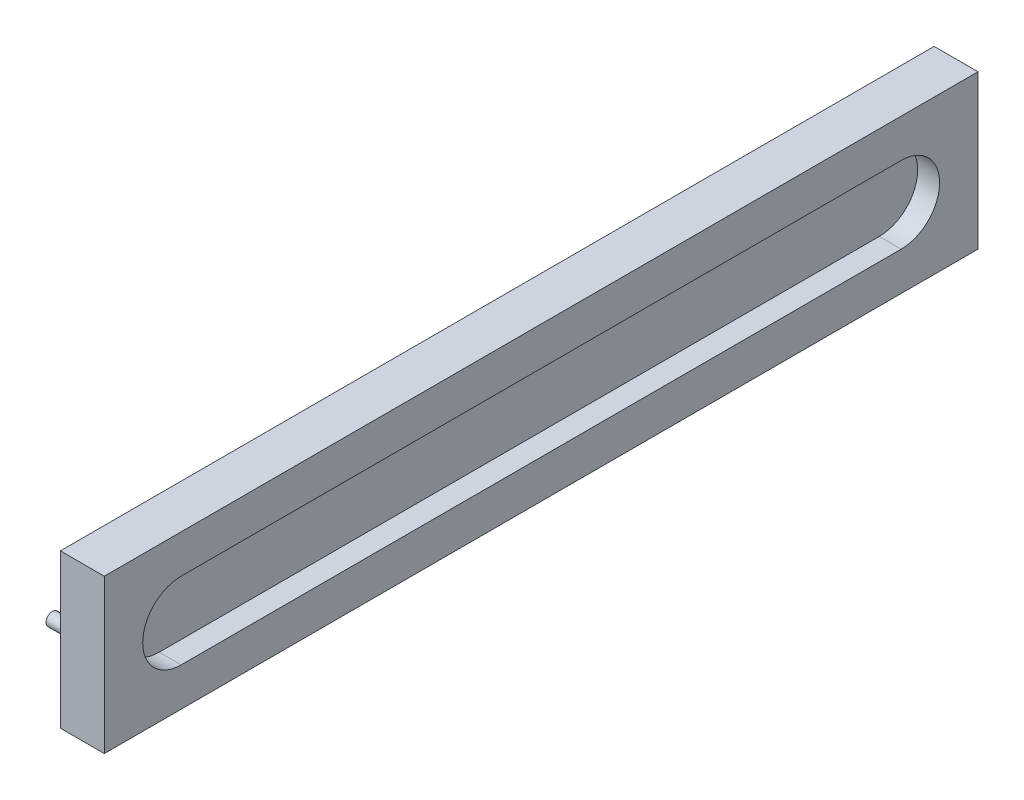
ISO-10303-21;
HEADER;
FILE_DESCRIPTION(('STEP AP214'),'2;1');
FILE_NAME('part.step','',(''),(''),'','','');
FILE_SCHEMA(('AUTOMOTIVE_DESIGN { 1 0 10303 214 1 1 1 1 }'));
ENDSEC;
DATA;
#1=APPLICATION_CONTEXT('core data for automotive mechanical design processes');
#2=APPLICATION_PROTOCOL_DEFINITION('international standard','automotive_design',2000,#1);
#3=PRODUCT_CONTEXT('',#1,'mechanical');
#4=PRODUCT('Part','Part','',(#3));
#5=PRODUCT_RELATED_PRODUCT_CATEGORY('part','',(#4));
#6=PRODUCT_DEFINITION_FORMATION('','',#4);
#7=PRODUCT_DEFINITION_CONTEXT('part definition',#1,'design');
#8=PRODUCT_DEFINITION('design','',#6,#7);
#9=PRODUCT_DEFINITION_SHAPE('','',#8);
#10=(LENGTH_UNIT() NAMED_UNIT(*) SI_UNIT(.MILLI.,.METRE.));
#11=(NAMED_UNIT(*) PLANE_ANGLE_UNIT() SI_UNIT($,.RADIAN.));
#12=(NAMED_UNIT(*) SI_UNIT($,.STERADIAN.) SOLID_ANGLE_UNIT());
#13=UNCERTAINTY_MEASURE_WITH_UNIT(LENGTH_MEASURE(1.E-05),#10,'distance_accuracy_value','');
#14=(GEOMETRIC_REPRESENTATION_CONTEXT(3) GLOBAL_UNCERTAINTY_ASSIGNED_CONTEXT((#13)) GLOBAL_UNIT_ASSIGNED_CONTEXT((#10,
#11,#12)) REPRESENTATION_CONTEXT('',''));
#15=CARTESIAN_POINT('',(0.,0.,0.));
#16=DIRECTION('',(0.,0.,1.));
#17=DIRECTION('',(1.,0.,0.));
#18=AXIS2_PLACEMENT_3D('',#15,#16,#17);
#19=CARTESIAN_POINT('',(20.,0.,0.));
#20=DIRECTION('',(0.,0.,-1.));
#21=DIRECTION('',(-1.,0.,0.));
#22=AXIS2_PLACEMENT_3D('',#19,#20,#21);
#23=PLANE('',#22);
#24=DIRECTION('',(0.,-1.,0.));
#25=VECTOR('',#24,1.);
#26=CARTESIAN_POINT('',(0.,0.,0.));
#27=LINE('',#26,#25);
#28=CARTESIAN_POINT('',(0.,70.,0.));
#29=VERTEX_POINT('',#28);
#30=CARTESIAN_POINT('',(0.,0.,0.));
#31=VERTEX_POINT('',#30);
#32=EDGE_CURVE('E149',#29,#31,#27,.T.);
#33=ORIENTED_EDGE('',*,*,#32,.T.);
#34=DIRECTION('',(-1.,0.,0.));
#35=VECTOR('',#34,1.);
#36=CARTESIAN_POINT('',(20.,0.,0.));
#37=LINE('',#36,#35);
#38=CARTESIAN_POINT('',(20.,0.,0.));
#39=VERTEX_POINT('',#38);
#40=EDGE_CURVE('E11',#39,#31,#37,.T.);
#41=ORIENTED_EDGE('',*,*,#40,.F.);
#42=DIRECTION('',(0.,-1.,0.));
#43=VECTOR('',#42,1.);
#44=CARTESIAN_POINT('',(20.,0.,0.));
#45=LINE('',#44,#43);
#46=CARTESIAN_POINT('',(20.,70.,0.));
#47=VERTEX_POINT('',#46);
#48=EDGE_CURVE('E153',#47,#39,#45,.T.);
#49=ORIENTED_EDGE('',*,*,#48,.F.);
#50=DIRECTION('',(-1.,0.,0.));
#51=VECTOR('',#50,1.);
#52=CARTESIAN_POINT('',(20.,70.,0.));
#53=LINE('',#52,#51);
#54=EDGE_CURVE('E159',#47,#29,#53,.T.);
#55=ORIENTED_EDGE('',*,*,#54,.T.);
#56=EDGE_LOOP('',(#33,#41,#49,#55));
#57=FACE_BOUND('',#56,.T.);
#58=ADVANCED_FACE('F37',(#57),#23,.F.);
#59=CARTESIAN_POINT('',(20.,0.,0.));
#60=DIRECTION('',(0.,1.,0.));
#61=DIRECTION('',(0.,0.,1.));
#62=AXIS2_PLACEMENT_3D('',#59,#60,#61);
#63=PLANE('',#62);
#64=DIRECTION('',(0.,0.,-1.));
#65=VECTOR('',#64,1.);
#66=CARTESIAN_POINT('',(0.,0.,0.));
#67=LINE('',#66,#65);
#68=CARTESIAN_POINT('',(0.,0.,-398.100558659218));
#69=VERTEX_POINT('',#68);
#70=EDGE_CURVE('E162',#31,#69,#67,.T.);
#71=ORIENTED_EDGE('',*,*,#70,.T.);
#72=DIRECTION('',(-1.,0.,0.));
#73=VECTOR('',#72,1.);
#74=CARTESIAN_POINT('',(20.,0.,-398.100558659218));
#75=LINE('',#74,#73);
#76=CARTESIAN_POINT('',(20.,0.,-398.100558659218));
#77=VERTEX_POINT('',#76);
#78=EDGE_CURVE('E44',#77,#69,#75,.T.);
#79=ORIENTED_EDGE('',*,*,#78,.F.);
#80=DIRECTION('',(0.,0.,-1.));
#81=VECTOR('',#80,1.);
#82=CARTESIAN_POINT('',(20.,0.,0.));
#83=LINE('',#82,#81);
#84=EDGE_CURVE('E88',#39,#77,#83,.T.);
#85=ORIENTED_EDGE('',*,*,#84,.F.);
#86=ORIENTED_EDGE('',*,*,#40,.T.);
#87=EDGE_LOOP('',(#71,#79,#85,#86));
#88=FACE_BOUND('',#87,.T.);
#89=ADVANCED_FACE('F191',(#88),#63,.F.);
#90=CARTESIAN_POINT('',(20.,0.,-398.100558659218));
#91=DIRECTION('',(0.,0.,1.));
#92=DIRECTION('',(1.,0.,0.));
#93=AXIS2_PLACEMENT_3D('',#90,#91,#92);
#94=PLANE('',#93);
#95=DIRECTION('',(0.,1.,0.));
#96=VECTOR('',#95,1.);
#97=CARTESIAN_POINT('',(0.,0.,-398.100558659218));
#98=LINE('',#97,#96);
#99=CARTESIAN_POINT('',(0.,70.,-398.100558659218));
#100=VERTEX_POINT('',#99);
#101=EDGE_CURVE('E164',#69,#100,#98,.T.);
#102=ORIENTED_EDGE('',*,*,#101,.T.);
#103=DIRECTION('',(-1.,0.,0.));
#104=VECTOR('',#103,1.);
#105=CARTESIAN_POINT('',(20.,70.,-398.100558659218));
#106=LINE('',#105,#104);
#107=CARTESIAN_POINT('',(20.,70.,-398.100558659218));
#108=VERTEX_POINT('',#107);
#109=EDGE_CURVE('E168',#108,#100,#106,.T.);
#110=ORIENTED_EDGE('',*,*,#109,.F.);
#111=DIRECTION('',(0.,1.,0.));
#112=VECTOR('',#111,1.);
#113=CARTESIAN_POINT('',(20.,0.,-398.100558659218));
#114=LINE('',#113,#112);
#115=EDGE_CURVE('E156',#77,#108,#114,.T.);
#116=ORIENTED_EDGE('',*,*,#115,.F.);
#117=ORIENTED_EDGE('',*,*,#78,.T.);
#118=EDGE_LOOP('',(#102,#110,#116,#117));
#119=FACE_BOUND('',#118,.T.);
#120=ADVANCED_FACE('F173',(#119),#94,.F.);
#121=CARTESIAN_POINT('',(20.,70.,0.));
#122=DIRECTION('',(0.,-1.,0.));
#123=DIRECTION('',(0.,0.,-1.));
#124=AXIS2_PLACEMENT_3D('',#121,#122,#123);
#125=PLANE('',#124);
#126=DIRECTION('',(0.,0.,1.));
#127=VECTOR('',#126,1.);
#128=CARTESIAN_POINT('',(0.,70.,0.));
#129=LINE('',#128,#127);
#130=EDGE_CURVE('E81',#100,#29,#129,.T.);
#131=ORIENTED_EDGE('',*,*,#130,.T.);
#132=ORIENTED_EDGE('',*,*,#54,.F.);
#133=DIRECTION('',(0.,0.,1.));
#134=VECTOR('',#133,1.);
#135=CARTESIAN_POINT('',(20.,70.,0.));
#136=LINE('',#135,#134);
#137=EDGE_CURVE('E60',#108,#47,#136,.T.);
#138=ORIENTED_EDGE('',*,*,#137,.F.);
#139=ORIENTED_EDGE('',*,*,#109,.T.);
#140=EDGE_LOOP('',(#131,#132,#138,#139));
#141=FACE_BOUND('',#140,.T.);
#142=ADVANCED_FACE('F181',(#141),#125,.F.);
#143=CARTESIAN_POINT('',(20.,0.,0.));
#144=DIRECTION('',(-1.,0.,0.));
#145=DIRECTION('',(0.,0.,1.));
#146=AXIS2_PLACEMENT_3D('',#143,#144,#145);
#147=PLANE('',#146);
#148=DIRECTION('',(0.,0.,-1.));
#149=VECTOR('',#148,1.);
#150=CARTESIAN_POINT('',(20.,17.5,-35.));
#151=LINE('',#150,#149);
#152=CARTESIAN_POINT('',(20.,17.5,-35.));
#153=VERTEX_POINT('',#152);
#154=CARTESIAN_POINT('',(20.,17.5,-363.100558659218));
#155=VERTEX_POINT('',#154);
#156=EDGE_CURVE('E142',#153,#155,#151,.T.);
#157=ORIENTED_EDGE('',*,*,#156,.F.);
#158=CARTESIAN_POINT('',(20.,35.,-35.));
#159=DIRECTION('',(1.,0.,0.));
#160=DIRECTION('',(0.,0.,-1.));
#161=AXIS2_PLACEMENT_3D('',#158,#159,#160);
#162=CIRCLE('',#161,17.5);
#163=CARTESIAN_POINT('',(20.,52.5,-35.));
#164=VERTEX_POINT('',#163);
#165=EDGE_CURVE('E51',#164,#153,#162,.T.);
#166=ORIENTED_EDGE('',*,*,#165,.F.);
#167=DIRECTION('',(0.,0.,1.));
#168=VECTOR('',#167,1.);
#169=CARTESIAN_POINT('',(20.,52.5,-35.));
#170=LINE('',#169,#168);
#171=CARTESIAN_POINT('',(20.,52.5,-363.100558659218));
#172=VERTEX_POINT('',#171);
#173=EDGE_CURVE('E130',#172,#164,#170,.T.);
#174=ORIENTED_EDGE('',*,*,#173,.F.);
#175=CARTESIAN_POINT('',(20.,35.,-363.100558659218));
#176=DIRECTION('',(1.,0.,0.));
#177=DIRECTION('',(0.,0.,1.));
#178=AXIS2_PLACEMENT_3D('',#175,#176,#177);
#179=CIRCLE('',#178,17.5);
#180=EDGE_CURVE('E133',#155,#172,#179,.T.);
#181=ORIENTED_EDGE('',*,*,#180,.F.);
#182=EDGE_LOOP('',(#157,#166,#174,#181));
#183=FACE_BOUND('',#182,.T.);
#184=ORIENTED_EDGE('',*,*,#48,.T.);
#185=ORIENTED_EDGE('',*,*,#84,.T.);
#186=ORIENTED_EDGE('',*,*,#115,.T.);
#187=ORIENTED_EDGE('',*,*,#137,.T.);
#188=EDGE_LOOP('',(#184,#185,#186,#187));
#189=FACE_BOUND('',#188,.T.);
#190=ADVANCED_FACE('F183',(#183,#189),#147,.F.);
#191=CARTESIAN_POINT('',(0.,0.,0.));
#192=DIRECTION('',(-1.,0.,0.));
#193=DIRECTION('',(0.,0.,1.));
#194=AXIS2_PLACEMENT_3D('',#191,#192,#193);
#195=PLANE('',#194);
#196=CARTESIAN_POINT('',(0.,35.,-6.35000000000002));
#197=DIRECTION('',(-1.,0.,0.));
#198=DIRECTION('',(0.,0.,-1.));
#199=AXIS2_PLACEMENT_3D('',#196,#197,#198);
#200=CIRCLE('',#199,2.921);
#201=CARTESIAN_POINT('',(0.,35.,-9.27100000000002));
#202=VERTEX_POINT('',#201);
#203=EDGE_CURVE('E311',#202,#202,#200,.T.);
#204=ORIENTED_EDGE('',*,*,#203,.F.);
#205=EDGE_LOOP('',(#204));
#206=FACE_BOUND('',#205,.T.);
#207=CARTESIAN_POINT('',(0.,35.,-391.750558659218));
#208=DIRECTION('',(-1.,0.,0.));
#209=DIRECTION('',(0.,0.,1.));
#210=AXIS2_PLACEMENT_3D('',#207,#208,#209);
#211=CIRCLE('',#210,2.921);
#212=CARTESIAN_POINT('',(0.,35.,-388.829558659218));
#213=VERTEX_POINT('',#212);
#214=EDGE_CURVE('E136',#213,#213,#211,.T.);
#215=ORIENTED_EDGE('',*,*,#214,.F.);
#216=EDGE_LOOP('',(#215));
#217=FACE_BOUND('',#216,.T.);
#218=ORIENTED_EDGE('',*,*,#32,.F.);
#219=ORIENTED_EDGE('',*,*,#130,.F.);
#220=ORIENTED_EDGE('',*,*,#101,.F.);
#221=ORIENTED_EDGE('',*,*,#70,.F.);
#222=EDGE_LOOP('',(#218,#219,#220,#221));
#223=FACE_BOUND('',#222,.T.);
#224=ADVANCED_FACE('F177',(#206,#217,#223),#195,.T.);
#225=CARTESIAN_POINT('',(10.,35.,-35.));
#226=DIRECTION('',(1.,0.,0.));
#227=DIRECTION('',(0.,0.,-1.));
#228=AXIS2_PLACEMENT_3D('',#225,#226,#227);
#229=CYLINDRICAL_SURFACE('',#228,17.5);
#230=ORIENTED_EDGE('',*,*,#165,.T.);
#231=DIRECTION('',(1.,0.,0.));
#232=VECTOR('',#231,1.);
#233=CARTESIAN_POINT('',(10.,17.5,-35.));
#234=LINE('',#233,#232);
#235=CARTESIAN_POINT('',(10.,17.5,-35.));
#236=VERTEX_POINT('',#235);
#237=EDGE_CURVE('E108',#236,#153,#234,.T.);
#238=ORIENTED_EDGE('',*,*,#237,.F.);
#239=CARTESIAN_POINT('',(10.,35.,-35.));
#240=DIRECTION('',(1.,0.,0.));
#241=DIRECTION('',(0.,0.,-1.));
#242=AXIS2_PLACEMENT_3D('',#239,#240,#241);
#243=CIRCLE('',#242,17.5);
#244=CARTESIAN_POINT('',(10.,52.5,-35.));
#245=VERTEX_POINT('',#244);
#246=EDGE_CURVE('E112',#245,#236,#243,.T.);
#247=ORIENTED_EDGE('',*,*,#246,.F.);
#248=DIRECTION('',(1.,0.,0.));
#249=VECTOR('',#248,1.);
#250=CARTESIAN_POINT('',(10.,52.5,-35.));
#251=LINE('',#250,#249);
#252=EDGE_CURVE('E147',#245,#164,#251,.T.);
#253=ORIENTED_EDGE('',*,*,#252,.T.);
#254=EDGE_LOOP('',(#230,#238,#247,#253));
#255=FACE_BOUND('',#254,.T.);
#256=ADVANCED_FACE('F110',(#255),#229,.F.);
#257=CARTESIAN_POINT('',(10.,52.5,-35.));
#258=DIRECTION('',(0.,1.,0.));
#259=DIRECTION('',(0.,0.,1.));
#260=AXIS2_PLACEMENT_3D('',#257,#258,#259);
#261=PLANE('',#260);
#262=ORIENTED_EDGE('',*,*,#173,.T.);
#263=ORIENTED_EDGE('',*,*,#252,.F.);
#264=DIRECTION('',(0.,0.,1.));
#265=VECTOR('',#264,1.);
#266=CARTESIAN_POINT('',(10.,52.5,-35.));
#267=LINE('',#266,#265);
#268=CARTESIAN_POINT('',(10.,52.5,-363.100558659218));
#269=VERTEX_POINT('',#268);
#270=EDGE_CURVE('E118',#269,#245,#267,.T.);
#271=ORIENTED_EDGE('',*,*,#270,.F.);
#272=DIRECTION('',(1.,0.,0.));
#273=VECTOR('',#272,1.);
#274=CARTESIAN_POINT('',(10.,52.5,-363.100558659218));
#275=LINE('',#274,#273);
#276=EDGE_CURVE('E150',#269,#172,#275,.T.);
#277=ORIENTED_EDGE('',*,*,#276,.T.);
#278=EDGE_LOOP('',(#262,#263,#271,#277));
#279=FACE_BOUND('',#278,.T.);
#280=ADVANCED_FACE('F225',(#279),#261,.F.);
#281=CARTESIAN_POINT('',(10.,35.,-363.100558659218));
#282=DIRECTION('',(1.,0.,0.));
#283=DIRECTION('',(0.,0.,-1.));
#284=AXIS2_PLACEMENT_3D('',#281,#282,#283);
#285=CYLINDRICAL_SURFACE('',#284,17.5);
#286=ORIENTED_EDGE('',*,*,#180,.T.);
#287=ORIENTED_EDGE('',*,*,#276,.F.);
#288=CARTESIAN_POINT('',(10.,35.,-363.100558659218));
#289=DIRECTION('',(1.,0.,0.));
#290=DIRECTION('',(0.,0.,1.));
#291=AXIS2_PLACEMENT_3D('',#288,#289,#290);
#292=CIRCLE('',#291,17.5);
#293=CARTESIAN_POINT('',(10.,17.5,-363.100558659218));
#294=VERTEX_POINT('',#293);
#295=EDGE_CURVE('E126',#294,#269,#292,.T.);
#296=ORIENTED_EDGE('',*,*,#295,.F.);
#297=DIRECTION('',(1.,0.,0.));
#298=VECTOR('',#297,1.);
#299=CARTESIAN_POINT('',(10.,17.5,-363.100558659218));
#300=LINE('',#299,#298);
#301=EDGE_CURVE('E117',#294,#155,#300,.T.);
#302=ORIENTED_EDGE('',*,*,#301,.T.);
#303=EDGE_LOOP('',(#286,#287,#296,#302));
#304=FACE_BOUND('',#303,.T.);
#305=ADVANCED_FACE('F234',(#304),#285,.F.);
#306=CARTESIAN_POINT('',(10.,17.5,-35.));
#307=DIRECTION('',(0.,-1.,0.));
#308=DIRECTION('',(0.,0.,-1.));
#309=AXIS2_PLACEMENT_3D('',#306,#307,#308);
#310=PLANE('',#309);
#311=ORIENTED_EDGE('',*,*,#156,.T.);
#312=ORIENTED_EDGE('',*,*,#301,.F.);
#313=DIRECTION('',(0.,0.,-1.));
#314=VECTOR('',#313,1.);
#315=CARTESIAN_POINT('',(10.,17.5,-35.));
#316=LINE('',#315,#314);
#317=EDGE_CURVE('E121',#236,#294,#316,.T.);
#318=ORIENTED_EDGE('',*,*,#317,.F.);
#319=ORIENTED_EDGE('',*,*,#237,.T.);
#320=EDGE_LOOP('',(#311,#312,#318,#319));
#321=FACE_BOUND('',#320,.T.);
#322=ADVANCED_FACE('F122',(#321),#310,.F.);
#323=CARTESIAN_POINT('',(10.,35.,-35.));
#324=DIRECTION('',(1.,0.,0.));
#325=DIRECTION('',(0.,0.,-1.));
#326=AXIS2_PLACEMENT_3D('',#323,#324,#325);
#327=PLANE('',#326);
#328=ORIENTED_EDGE('',*,*,#246,.T.);
#329=ORIENTED_EDGE('',*,*,#317,.T.);
#330=ORIENTED_EDGE('',*,*,#295,.T.);
#331=ORIENTED_EDGE('',*,*,#270,.T.);
#332=EDGE_LOOP('',(#328,#329,#330,#331));
#333=FACE_BOUND('',#332,.T.);
#334=ADVANCED_FACE('F128',(#333),#327,.T.);
#335=CARTESIAN_POINT('',(-10.,35.,-391.750558659218));
#336=DIRECTION('',(1.,0.,0.));
#337=DIRECTION('',(0.,0.,-1.));
#338=AXIS2_PLACEMENT_3D('',#335,#336,#337);
#339=CYLINDRICAL_SURFACE('',#338,2.921);
#340=CARTESIAN_POINT('',(-10.,35.,-391.750558659218));
#341=DIRECTION('',(-1.,0.,0.));
#342=DIRECTION('',(0.,0.,1.));
#343=AXIS2_PLACEMENT_3D('',#340,#341,#342);
#344=CIRCLE('',#343,2.921);
#345=CARTESIAN_POINT('',(-10.,35.,-388.829558659218));
#346=VERTEX_POINT('',#345);
#347=EDGE_CURVE('E143',#346,#346,#344,.T.);
#348=ORIENTED_EDGE('',*,*,#347,.F.);
#349=EDGE_LOOP('',(#348));
#350=FACE_BOUND('',#349,.T.);
#351=ORIENTED_EDGE('',*,*,#214,.T.);
#352=EDGE_LOOP('',(#351));
#353=FACE_BOUND('',#352,.T.);
#354=ADVANCED_FACE('F261',(#350,#353),#339,.T.);
#355=CARTESIAN_POINT('',(-10.,35.,-391.750558659218));
#356=DIRECTION('',(-1.,0.,0.));
#357=DIRECTION('',(0.,0.,1.));
#358=AXIS2_PLACEMENT_3D('',#355,#356,#357);
#359=PLANE('',#358);
#360=ORIENTED_EDGE('',*,*,#347,.T.);
#361=EDGE_LOOP('',(#360));
#362=FACE_BOUND('',#361,.T.);
#363=ADVANCED_FACE('F274',(#362),#359,.T.);
#364=CARTESIAN_POINT('',(-10.,35.,-6.35000000000002));
#365=DIRECTION('',(1.,0.,0.));
#366=DIRECTION('',(0.,0.,-1.));
#367=AXIS2_PLACEMENT_3D('',#364,#365,#366);
#368=CYLINDRICAL_SURFACE('',#367,2.921);
#369=CARTESIAN_POINT('',(-10.,35.,-6.35000000000002));
#370=DIRECTION('',(-1.,0.,0.));
#371=DIRECTION('',(0.,0.,-1.));
#372=AXIS2_PLACEMENT_3D('',#369,#370,#371);
#373=CIRCLE('',#372,2.921);
#374=CARTESIAN_POINT('',(-10.,35.,-9.27100000000002));
#375=VERTEX_POINT('',#374);
#376=EDGE_CURVE('E310',#375,#375,#373,.T.);
#377=ORIENTED_EDGE('',*,*,#376,.F.);
#378=EDGE_LOOP('',(#377));
#379=FACE_BOUND('',#378,.T.);
#380=ORIENTED_EDGE('',*,*,#203,.T.);
#381=EDGE_LOOP('',(#380));
#382=FACE_BOUND('',#381,.T.);
#383=ADVANCED_FACE('F284',(#379,#382),#368,.T.);
#384=CARTESIAN_POINT('',(-10.,35.,-6.35000000000002));
#385=DIRECTION('',(1.,0.,0.));
#386=DIRECTION('',(0.,0.,-1.));
#387=AXIS2_PLACEMENT_3D('',#384,#385,#386);
#388=PLANE('',#387);
#389=ORIENTED_EDGE('',*,*,#376,.T.);
#390=EDGE_LOOP('',(#389));
#391=FACE_BOUND('',#390,.T.);
#392=ADVANCED_FACE('F294',(#391),#388,.F.);
#393=CLOSED_SHELL('',(#58,#89,#120,#142,#190,#224,#256,#280,#305,#322,#334,#354,#363,#383,#392));
#394=MANIFOLD_SOLID_BREP('B2',#393);
#395=ADVANCED_BREP_SHAPE_REPRESENTATION('',(#18,#394),#14);
#396=SHAPE_DEFINITION_REPRESENTATION(#9,#395);
ENDSEC;
END-ISO-10303-21;
